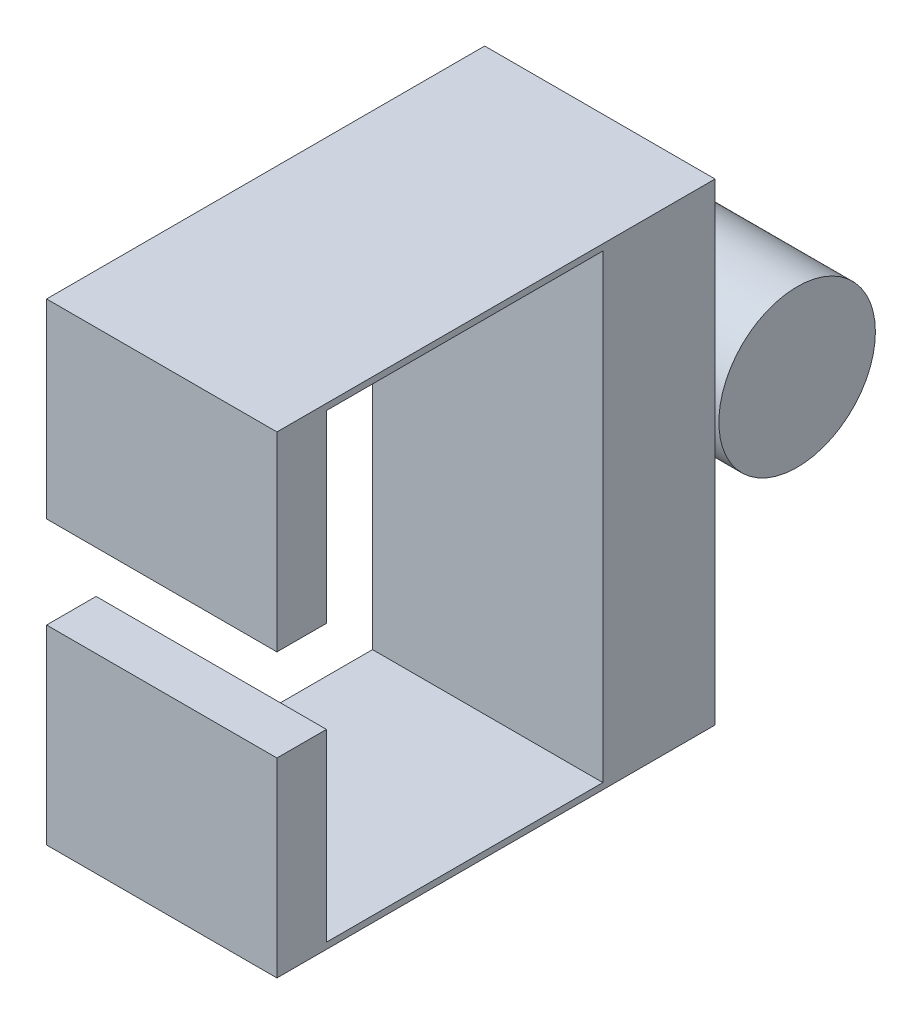
ISO-10303-21;
HEADER;
FILE_DESCRIPTION(('STEP AP214'),'2;1');
FILE_NAME('part.step','',(''),(''),'','','');
FILE_SCHEMA(('AUTOMOTIVE_DESIGN { 1 0 10303 214 1 1 1 1 }'));
ENDSEC;
DATA;
#1=APPLICATION_CONTEXT('core data for automotive mechanical design processes');
#2=APPLICATION_PROTOCOL_DEFINITION('international standard','automotive_design',2000,#1);
#3=PRODUCT_CONTEXT('',#1,'mechanical');
#4=PRODUCT('Part','Part','',(#3));
#5=PRODUCT_RELATED_PRODUCT_CATEGORY('part','',(#4));
#6=PRODUCT_DEFINITION_FORMATION('','',#4);
#7=PRODUCT_DEFINITION_CONTEXT('part definition',#1,'design');
#8=PRODUCT_DEFINITION('design','',#6,#7);
#9=PRODUCT_DEFINITION_SHAPE('','',#8);
#10=(LENGTH_UNIT() NAMED_UNIT(*) SI_UNIT(.MILLI.,.METRE.));
#11=(NAMED_UNIT(*) PLANE_ANGLE_UNIT() SI_UNIT($,.RADIAN.));
#12=(NAMED_UNIT(*) SI_UNIT($,.STERADIAN.) SOLID_ANGLE_UNIT());
#13=UNCERTAINTY_MEASURE_WITH_UNIT(LENGTH_MEASURE(1.E-05),#10,'distance_accuracy_value','');
#14=(GEOMETRIC_REPRESENTATION_CONTEXT(3) GLOBAL_UNCERTAINTY_ASSIGNED_CONTEXT((#13)) GLOBAL_UNIT_ASSIGNED_CONTEXT((#10,
#11,#12)) REPRESENTATION_CONTEXT('',''));
#15=CARTESIAN_POINT('',(0.,0.,0.));
#16=DIRECTION('',(0.,0.,1.));
#17=DIRECTION('',(1.,0.,0.));
#18=AXIS2_PLACEMENT_3D('',#15,#16,#17);
#19=CARTESIAN_POINT('',(-3.05675929736877,31.72968,74.9989691432887));
#20=DIRECTION('',(0.,1.,0.));
#21=DIRECTION('',(-1.,0.,0.));
#22=AXIS2_PLACEMENT_3D('',#19,#20,#21);
#23=PLANE('',#22);
#24=DIRECTION('',(1.,0.,0.));
#25=VECTOR('',#24,1.);
#26=CARTESIAN_POINT('',(-3.05675929736877,31.72968,68.1736477814844));
#27=LINE('',#26,#25);
#28=CARTESIAN_POINT('',(-3.05675929736877,31.72968,68.1736477814844));
#29=VERTEX_POINT('',#28);
#30=CARTESIAN_POINT('',(28.6932407026312,31.72968,68.1736477814844));
#31=VERTEX_POINT('',#30);
#32=EDGE_CURVE('E62',#29,#31,#27,.T.);
#33=ORIENTED_EDGE('',*,*,#32,.F.);
#34=DIRECTION('',(0.,0.,-1.));
#35=VECTOR('',#34,1.);
#36=CARTESIAN_POINT('',(-3.05675929736877,31.72968,74.9989691432887));
#37=LINE('',#36,#35);
#38=CARTESIAN_POINT('',(-3.05675929736877,31.72968,30.0736477814844));
#39=VERTEX_POINT('',#38);
#40=EDGE_CURVE('E11',#29,#39,#37,.T.);
#41=ORIENTED_EDGE('',*,*,#40,.T.);
#42=DIRECTION('',(1.,0.,0.));
#43=VECTOR('',#42,1.);
#44=CARTESIAN_POINT('',(-3.05675929736877,31.72968,30.0736477814844));
#45=LINE('',#44,#43);
#46=CARTESIAN_POINT('',(28.6932407026312,31.72968,30.0736477814844));
#47=VERTEX_POINT('',#46);
#48=EDGE_CURVE('E103',#39,#47,#45,.T.);
#49=ORIENTED_EDGE('',*,*,#48,.T.);
#50=DIRECTION('',(0.,0.,-1.));
#51=VECTOR('',#50,1.);
#52=CARTESIAN_POINT('',(28.6932407026312,31.72968,74.9989691432887));
#53=LINE('',#52,#51);
#54=EDGE_CURVE('E56',#31,#47,#53,.T.);
#55=ORIENTED_EDGE('',*,*,#54,.F.);
#56=EDGE_LOOP('',(#33,#41,#49,#55));
#57=FACE_BOUND('',#56,.T.);
#58=ADVANCED_FACE('F47',(#57),#23,.F.);
#59=CARTESIAN_POINT('',(-3.05675929736877,32.5937994297519,74.9989691432887));
#60=DIRECTION('',(1.,0.,0.));
#61=DIRECTION('',(0.,0.,-1.));
#62=AXIS2_PLACEMENT_3D('',#59,#60,#61);
#63=PLANE('',#62);
#64=DIRECTION('',(0.,0.,-1.));
#65=VECTOR('',#64,1.);
#66=CARTESIAN_POINT('',(-3.05675929736877,32.5937994297519,74.9989691432887));
#67=LINE('',#66,#65);
#68=CARTESIAN_POINT('',(-3.05675929736877,32.5937994297519,74.9989691432887));
#69=VERTEX_POINT('',#68);
#70=CARTESIAN_POINT('',(-3.05675929736877,32.5937994297519,14.6102924320035));
#71=VERTEX_POINT('',#70);
#72=EDGE_CURVE('E153',#69,#71,#67,.T.);
#73=ORIENTED_EDGE('',*,*,#72,.T.);
#74=DIRECTION('',(0.,-1.,0.));
#75=VECTOR('',#74,1.);
#76=CARTESIAN_POINT('',(-3.05675929736877,32.5937994297519,14.6102924320035));
#77=LINE('',#76,#75);
#78=CARTESIAN_POINT('',(-3.05675929736877,12.7,14.6102924320035));
#79=VERTEX_POINT('',#78);
#80=EDGE_CURVE('E190',#71,#79,#77,.T.);
#81=ORIENTED_EDGE('',*,*,#80,.T.);
#82=DIRECTION('',(0.,0.,-1.));
#83=VECTOR('',#82,1.);
#84=CARTESIAN_POINT('',(-3.05675929736877,12.7,-0.629707567996452));
#85=LINE('',#84,#83);
#86=CARTESIAN_POINT('',(-3.05675929736877,12.7,-0.629707567996452));
#87=VERTEX_POINT('',#86);
#88=EDGE_CURVE('E214',#79,#87,#85,.T.);
#89=ORIENTED_EDGE('',*,*,#88,.T.);
#90=CARTESIAN_POINT('',(-3.05675929736877,2.54,-0.62970756799652));
#91=DIRECTION('',(-1.,0.,0.));
#92=DIRECTION('',(0.,0.,-1.));
#93=AXIS2_PLACEMENT_3D('',#90,#91,#92);
#94=CIRCLE('',#93,10.16);
#95=CARTESIAN_POINT('',(-3.05675929736877,2.53999999999993,-10.7897075679965));
#96=VERTEX_POINT('',#95);
#97=EDGE_CURVE('E218',#87,#96,#94,.T.);
#98=ORIENTED_EDGE('',*,*,#97,.T.);
#99=DIRECTION('',(0.,-1.,0.));
#100=VECTOR('',#99,1.);
#101=CARTESIAN_POINT('',(-3.05675929736877,-2.53999999999993,-10.7897075679965));
#102=LINE('',#101,#100);
#103=CARTESIAN_POINT('',(-3.05675929736877,-2.53999999999993,-10.7897075679965));
#104=VERTEX_POINT('',#103);
#105=EDGE_CURVE('E222',#96,#104,#102,.T.);
#106=ORIENTED_EDGE('',*,*,#105,.T.);
#107=CARTESIAN_POINT('',(-3.05675929736877,-2.54,-0.629707567996522));
#108=DIRECTION('',(-1.,0.,0.));
#109=DIRECTION('',(0.,0.,-1.));
#110=AXIS2_PLACEMENT_3D('',#107,#108,#109);
#111=CIRCLE('',#110,10.16);
#112=CARTESIAN_POINT('',(-3.05675929736877,-12.7,-0.629707567996445));
#113=VERTEX_POINT('',#112);
#114=EDGE_CURVE('E205',#104,#113,#111,.T.);
#115=ORIENTED_EDGE('',*,*,#114,.T.);
#116=DIRECTION('',(0.,0.,1.));
#117=VECTOR('',#116,1.);
#118=CARTESIAN_POINT('',(-3.05675929736877,-12.7,-0.629707567996445));
#119=LINE('',#118,#117);
#120=CARTESIAN_POINT('',(-3.05675929736877,-12.7,14.6102924320035));
#121=VERTEX_POINT('',#120);
#122=EDGE_CURVE('E209',#113,#121,#119,.T.);
#123=ORIENTED_EDGE('',*,*,#122,.T.);
#124=CARTESIAN_POINT('',(-3.05675929736876,-32.5937994297519,14.6102924320035));
#125=VERTEX_POINT('',#124);
#126=EDGE_CURVE('E189',#121,#125,#77,.T.);
#127=ORIENTED_EDGE('',*,*,#126,.T.);
#128=DIRECTION('',(0.,0.,-1.));
#129=VECTOR('',#128,1.);
#130=CARTESIAN_POINT('',(-3.05675929736876,-32.5937994297519,30.0736477814844));
#131=LINE('',#130,#129);
#132=CARTESIAN_POINT('',(-3.05675929736877,-32.5937994297519,74.9989691432887));
#133=VERTEX_POINT('',#132);
#134=EDGE_CURVE('E200',#133,#125,#131,.T.);
#135=ORIENTED_EDGE('',*,*,#134,.F.);
#136=DIRECTION('',(0.,1.,0.));
#137=VECTOR('',#136,1.);
#138=CARTESIAN_POINT('',(-3.05675929736877,-32.5937994297519,74.9989691432887));
#139=LINE('',#138,#137);
#140=CARTESIAN_POINT('',(-3.05675929736877,-6.32968,74.9989691432887));
#141=VERTEX_POINT('',#140);
#142=EDGE_CURVE('E611',#133,#141,#139,.T.);
#143=ORIENTED_EDGE('',*,*,#142,.T.);
#144=DIRECTION('',(0.,0.,-1.));
#145=VECTOR('',#144,1.);
#146=CARTESIAN_POINT('',(-3.05675929736877,-6.32968,74.9989691432887));
#147=LINE('',#146,#145);
#148=CARTESIAN_POINT('',(-3.05675929736877,-6.32968,68.1736477814844));
#149=VERTEX_POINT('',#148);
#150=EDGE_CURVE('E594',#141,#149,#147,.T.);
#151=ORIENTED_EDGE('',*,*,#150,.T.);
#152=DIRECTION('',(0.,-1.,0.));
#153=VECTOR('',#152,1.);
#154=CARTESIAN_POINT('',(-3.05675929736877,-6.32968,68.1736477814844));
#155=LINE('',#154,#153);
#156=CARTESIAN_POINT('',(-3.05675929736877,-31.72968,68.1736477814844));
#157=VERTEX_POINT('',#156);
#158=EDGE_CURVE('E625',#149,#157,#155,.T.);
#159=ORIENTED_EDGE('',*,*,#158,.T.);
#160=DIRECTION('',(0.,0.,-1.));
#161=VECTOR('',#160,1.);
#162=CARTESIAN_POINT('',(-3.05675929736877,-31.72968,74.9989691432887));
#163=LINE('',#162,#161);
#164=CARTESIAN_POINT('',(-3.05675929736877,-31.72968,30.0736477814844));
#165=VERTEX_POINT('',#164);
#166=EDGE_CURVE('E170',#157,#165,#163,.T.);
#167=ORIENTED_EDGE('',*,*,#166,.T.);
#168=DIRECTION('',(0.,-1.,0.));
#169=VECTOR('',#168,1.);
#170=CARTESIAN_POINT('',(-3.05675929736877,32.5937994297519,30.0736477814844));
#171=LINE('',#170,#169);
#172=EDGE_CURVE('E166',#39,#165,#171,.T.);
#173=ORIENTED_EDGE('',*,*,#172,.F.);
#174=ORIENTED_EDGE('',*,*,#40,.F.);
#175=DIRECTION('',(0.,1.,0.));
#176=VECTOR('',#175,1.);
#177=CARTESIAN_POINT('',(-3.05675929736877,6.32968,68.1736477814844));
#178=LINE('',#177,#176);
#179=CARTESIAN_POINT('',(-3.05675929736877,6.32968,68.1736477814844));
#180=VERTEX_POINT('',#179);
#181=EDGE_CURVE('E130',#180,#29,#178,.T.);
#182=ORIENTED_EDGE('',*,*,#181,.F.);
#183=DIRECTION('',(0.,0.,-1.));
#184=VECTOR('',#183,1.);
#185=CARTESIAN_POINT('',(-3.05675929736877,6.32968,74.9989691432887));
#186=LINE('',#185,#184);
#187=CARTESIAN_POINT('',(-3.05675929736877,6.32968,74.9989691432887));
#188=VERTEX_POINT('',#187);
#189=EDGE_CURVE('E119',#188,#180,#186,.T.);
#190=ORIENTED_EDGE('',*,*,#189,.F.);
#191=DIRECTION('',(0.,-1.,0.));
#192=VECTOR('',#191,1.);
#193=CARTESIAN_POINT('',(-3.05675929736877,32.5937994297519,74.9989691432887));
#194=LINE('',#193,#192);
#195=EDGE_CURVE('E88',#69,#188,#194,.T.);
#196=ORIENTED_EDGE('',*,*,#195,.F.);
#197=EDGE_LOOP('',(#73,#81,#89,#98,#106,#115,#123,#127,#135,#143,#151,#159,#167,#173,#174,#182,
#190,#196));
#198=FACE_BOUND('',#197,.T.);
#199=ADVANCED_FACE('F49',(#198),#63,.F.);
#200=CARTESIAN_POINT('',(28.6932407026312,32.5937994297519,74.9989691432887));
#201=DIRECTION('',(-1.,0.,0.));
#202=DIRECTION('',(0.,0.,1.));
#203=AXIS2_PLACEMENT_3D('',#200,#201,#202);
#204=PLANE('',#203);
#205=ORIENTED_EDGE('',*,*,#54,.T.);
#206=DIRECTION('',(0.,1.,0.));
#207=VECTOR('',#206,1.);
#208=CARTESIAN_POINT('',(28.6932407026312,32.5937994297519,30.0736477814844));
#209=LINE('',#208,#207);
#210=CARTESIAN_POINT('',(28.6932407026312,-31.72968,30.0736477814844));
#211=VERTEX_POINT('',#210);
#212=EDGE_CURVE('E82',#211,#47,#209,.T.);
#213=ORIENTED_EDGE('',*,*,#212,.F.);
#214=DIRECTION('',(0.,0.,-1.));
#215=VECTOR('',#214,1.);
#216=CARTESIAN_POINT('',(28.6932407026312,-31.72968,74.9989691432887));
#217=LINE('',#216,#215);
#218=CARTESIAN_POINT('',(28.6932407026312,-31.72968,68.1736477814844));
#219=VERTEX_POINT('',#218);
#220=EDGE_CURVE('E631',#219,#211,#217,.T.);
#221=ORIENTED_EDGE('',*,*,#220,.F.);
#222=DIRECTION('',(0.,-1.,0.));
#223=VECTOR('',#222,1.);
#224=CARTESIAN_POINT('',(28.6932407026312,-6.32968,68.1736477814844));
#225=LINE('',#224,#223);
#226=CARTESIAN_POINT('',(28.6932407026312,-6.32968,68.1736477814844));
#227=VERTEX_POINT('',#226);
#228=EDGE_CURVE('E665',#227,#219,#225,.T.);
#229=ORIENTED_EDGE('',*,*,#228,.F.);
#230=DIRECTION('',(0.,0.,1.));
#231=VECTOR('',#230,1.);
#232=CARTESIAN_POINT('',(28.6932407026312,-6.32968,74.9989691432887));
#233=LINE('',#232,#231);
#234=CARTESIAN_POINT('',(28.6932407026312,-6.32968,74.9989691432887));
#235=VERTEX_POINT('',#234);
#236=EDGE_CURVE('E667',#227,#235,#233,.T.);
#237=ORIENTED_EDGE('',*,*,#236,.T.);
#238=DIRECTION('',(0.,-1.,0.));
#239=VECTOR('',#238,1.);
#240=CARTESIAN_POINT('',(28.6932407026312,-32.5937994297519,74.9989691432887));
#241=LINE('',#240,#239);
#242=CARTESIAN_POINT('',(28.6932407026312,-32.5937994297519,74.9989691432887));
#243=VERTEX_POINT('',#242);
#244=EDGE_CURVE('E617',#235,#243,#241,.T.);
#245=ORIENTED_EDGE('',*,*,#244,.T.);
#246=DIRECTION('',(0.,0.,-1.));
#247=VECTOR('',#246,1.);
#248=CARTESIAN_POINT('',(28.6932407026312,-32.5937994297519,30.0736477814844));
#249=LINE('',#248,#247);
#250=CARTESIAN_POINT('',(28.6932407026312,-32.5937994297519,14.6102924320035));
#251=VERTEX_POINT('',#250);
#252=EDGE_CURVE('E177',#243,#251,#249,.T.);
#253=ORIENTED_EDGE('',*,*,#252,.T.);
#254=DIRECTION('',(0.,1.,0.));
#255=VECTOR('',#254,1.);
#256=CARTESIAN_POINT('',(28.6932407026312,32.5937994297519,14.6102924320035));
#257=LINE('',#256,#255);
#258=CARTESIAN_POINT('',(28.6932407026312,32.5937994297519,14.6102924320035));
#259=VERTEX_POINT('',#258);
#260=EDGE_CURVE('E173',#251,#259,#257,.T.);
#261=ORIENTED_EDGE('',*,*,#260,.T.);
#262=DIRECTION('',(0.,0.,-1.));
#263=VECTOR('',#262,1.);
#264=CARTESIAN_POINT('',(28.6932407026312,32.5937994297519,74.9989691432887));
#265=LINE('',#264,#263);
#266=CARTESIAN_POINT('',(28.6932407026312,32.5937994297519,74.9989691432887));
#267=VERTEX_POINT('',#266);
#268=EDGE_CURVE('E159',#267,#259,#265,.T.);
#269=ORIENTED_EDGE('',*,*,#268,.F.);
#270=DIRECTION('',(0.,1.,0.));
#271=VECTOR('',#270,1.);
#272=CARTESIAN_POINT('',(28.6932407026312,32.5937994297519,74.9989691432887));
#273=LINE('',#272,#271);
#274=CARTESIAN_POINT('',(28.6932407026312,6.32968,74.9989691432887));
#275=VERTEX_POINT('',#274);
#276=EDGE_CURVE('E135',#275,#267,#273,.T.);
#277=ORIENTED_EDGE('',*,*,#276,.F.);
#278=DIRECTION('',(0.,0.,1.));
#279=VECTOR('',#278,1.);
#280=CARTESIAN_POINT('',(28.6932407026312,6.32968,74.9989691432887));
#281=LINE('',#280,#279);
#282=CARTESIAN_POINT('',(28.6932407026312,6.32968,68.1736477814844));
#283=VERTEX_POINT('',#282);
#284=EDGE_CURVE('E117',#283,#275,#281,.T.);
#285=ORIENTED_EDGE('',*,*,#284,.F.);
#286=DIRECTION('',(0.,1.,0.));
#287=VECTOR('',#286,1.);
#288=CARTESIAN_POINT('',(28.6932407026312,6.32968,68.1736477814844));
#289=LINE('',#288,#287);
#290=EDGE_CURVE('E126',#283,#31,#289,.T.);
#291=ORIENTED_EDGE('',*,*,#290,.T.);
#292=EDGE_LOOP('',(#205,#213,#221,#229,#237,#245,#253,#261,#269,#277,#285,#291));
#293=FACE_BOUND('',#292,.T.);
#294=ADVANCED_FACE('F133',(#293),#204,.F.);
#295=CARTESIAN_POINT('',(-3.05675929736877,32.5937994297519,74.9989691432887));
#296=DIRECTION('',(0.,-1.,0.));
#297=DIRECTION('',(1.,0.,0.));
#298=AXIS2_PLACEMENT_3D('',#295,#296,#297);
#299=PLANE('',#298);
#300=ORIENTED_EDGE('',*,*,#268,.T.);
#301=DIRECTION('',(-1.,0.,0.));
#302=VECTOR('',#301,1.);
#303=CARTESIAN_POINT('',(-3.05675929736877,32.5937994297519,14.6102924320035));
#304=LINE('',#303,#302);
#305=EDGE_CURVE('E185',#259,#71,#304,.T.);
#306=ORIENTED_EDGE('',*,*,#305,.T.);
#307=ORIENTED_EDGE('',*,*,#72,.F.);
#308=DIRECTION('',(-1.,0.,0.));
#309=VECTOR('',#308,1.);
#310=CARTESIAN_POINT('',(-3.05675929736877,32.5937994297519,74.9989691432887));
#311=LINE('',#310,#309);
#312=EDGE_CURVE('E71',#267,#69,#311,.T.);
#313=ORIENTED_EDGE('',*,*,#312,.F.);
#314=EDGE_LOOP('',(#300,#306,#307,#313));
#315=FACE_BOUND('',#314,.T.);
#316=ADVANCED_FACE('F355',(#315),#299,.F.);
#317=CARTESIAN_POINT('',(0.,0.,74.9989691432887));
#318=DIRECTION('',(0.,0.,1.));
#319=DIRECTION('',(1.,0.,0.));
#320=AXIS2_PLACEMENT_3D('',#317,#318,#319);
#321=PLANE('',#320);
#322=ORIENTED_EDGE('',*,*,#195,.T.);
#323=DIRECTION('',(-1.,0.,0.));
#324=VECTOR('',#323,1.);
#325=CARTESIAN_POINT('',(-3.05675929736877,6.32968,74.9989691432887));
#326=LINE('',#325,#324);
#327=EDGE_CURVE('E131',#275,#188,#326,.T.);
#328=ORIENTED_EDGE('',*,*,#327,.F.);
#329=ORIENTED_EDGE('',*,*,#276,.T.);
#330=ORIENTED_EDGE('',*,*,#312,.T.);
#331=EDGE_LOOP('',(#322,#328,#329,#330));
#332=FACE_BOUND('',#331,.T.);
#333=ADVANCED_FACE('F357',(#332),#321,.T.);
#334=CARTESIAN_POINT('',(-3.05675929736877,6.32968,68.1736477814844));
#335=DIRECTION('',(0.,0.,1.));
#336=DIRECTION('',(1.,0.,0.));
#337=AXIS2_PLACEMENT_3D('',#334,#335,#336);
#338=PLANE('',#337);
#339=ORIENTED_EDGE('',*,*,#32,.T.);
#340=ORIENTED_EDGE('',*,*,#290,.F.);
#341=DIRECTION('',(1.,0.,0.));
#342=VECTOR('',#341,1.);
#343=CARTESIAN_POINT('',(-3.05675929736877,6.32968,68.1736477814844));
#344=LINE('',#343,#342);
#345=EDGE_CURVE('E113',#180,#283,#344,.T.);
#346=ORIENTED_EDGE('',*,*,#345,.F.);
#347=ORIENTED_EDGE('',*,*,#181,.T.);
#348=EDGE_LOOP('',(#339,#340,#346,#347));
#349=FACE_BOUND('',#348,.T.);
#350=ADVANCED_FACE('F127',(#349),#338,.F.);
#351=CARTESIAN_POINT('',(0.,6.32968,0.));
#352=DIRECTION('',(0.,-1.,0.));
#353=DIRECTION('',(1.,0.,0.));
#354=AXIS2_PLACEMENT_3D('',#351,#352,#353);
#355=PLANE('',#354);
#356=ORIENTED_EDGE('',*,*,#189,.T.);
#357=ORIENTED_EDGE('',*,*,#345,.T.);
#358=ORIENTED_EDGE('',*,*,#284,.T.);
#359=ORIENTED_EDGE('',*,*,#327,.T.);
#360=EDGE_LOOP('',(#356,#357,#358,#359));
#361=FACE_BOUND('',#360,.T.);
#362=ADVANCED_FACE('F115',(#361),#355,.T.);
#363=CARTESIAN_POINT('',(25.4,0.,0.));
#364=DIRECTION('',(-1.,0.,0.));
#365=DIRECTION('',(0.,0.,1.));
#366=AXIS2_PLACEMENT_3D('',#363,#364,#365);
#367=CYLINDRICAL_SURFACE('',#366,10.7897075679965);
#368=CARTESIAN_POINT('',(25.4,0.,0.));
#369=DIRECTION('',(1.,0.,0.));
#370=DIRECTION('',(0.,0.,-1.));
#371=AXIS2_PLACEMENT_3D('',#368,#369,#370);
#372=CIRCLE('',#371,10.7897075679965);
#373=CARTESIAN_POINT('',(25.4,0.,-10.7897075679965));
#374=VERTEX_POINT('',#373);
#375=EDGE_CURVE('E143',#374,#374,#372,.T.);
#376=ORIENTED_EDGE('',*,*,#375,.F.);
#377=EDGE_LOOP('',(#376));
#378=FACE_BOUND('',#377,.T.);
#379=CARTESIAN_POINT('',(0.,0.,0.));
#380=DIRECTION('',(1.,0.,0.));
#381=DIRECTION('',(0.,0.,-1.));
#382=AXIS2_PLACEMENT_3D('',#379,#380,#381);
#383=CIRCLE('',#382,10.7897075679965);
#384=CARTESIAN_POINT('',(0.,0.,-10.7897075679965));
#385=VERTEX_POINT('',#384);
#386=EDGE_CURVE('E273',#385,#385,#383,.T.);
#387=ORIENTED_EDGE('',*,*,#386,.T.);
#388=EDGE_LOOP('',(#387));
#389=FACE_BOUND('',#388,.T.);
#390=ADVANCED_FACE('F336',(#378,#389),#367,.T.);
#391=CARTESIAN_POINT('',(25.4,0.,0.));
#392=DIRECTION('',(1.,0.,0.));
#393=DIRECTION('',(0.,0.,-1.));
#394=AXIS2_PLACEMENT_3D('',#391,#392,#393);
#395=PLANE('',#394);
#396=ORIENTED_EDGE('',*,*,#375,.T.);
#397=EDGE_LOOP('',(#396));
#398=FACE_BOUND('',#397,.T.);
#399=ADVANCED_FACE('F338',(#398),#395,.T.);
#400=CARTESIAN_POINT('',(0.,-2.54,-0.629707567996522));
#401=DIRECTION('',(1.,0.,0.));
#402=DIRECTION('',(0.,0.,-1.));
#403=AXIS2_PLACEMENT_3D('',#400,#401,#402);
#404=PLANE('',#403);
#405=DIRECTION('',(0.,-1.,0.));
#406=VECTOR('',#405,1.);
#407=CARTESIAN_POINT('',(0.,-2.53999999999993,-10.7897075679965));
#408=LINE('',#407,#406);
#409=CARTESIAN_POINT('',(0.,-2.53999999999993,-10.7897075679965));
#410=VERTEX_POINT('',#409);
#411=EDGE_CURVE('E246',#385,#410,#408,.T.);
#412=ORIENTED_EDGE('',*,*,#411,.F.);
#413=ORIENTED_EDGE('',*,*,#386,.F.);
#414=CARTESIAN_POINT('',(0.,2.53999999999993,-10.7897075679965));
#415=VERTEX_POINT('',#414);
#416=EDGE_CURVE('E210',#415,#385,#408,.T.);
#417=ORIENTED_EDGE('',*,*,#416,.F.);
#418=CARTESIAN_POINT('',(0.,2.54,-0.62970756799652));
#419=DIRECTION('',(-1.,0.,0.));
#420=DIRECTION('',(0.,0.,-1.));
#421=AXIS2_PLACEMENT_3D('',#418,#419,#420);
#422=CIRCLE('',#421,10.16);
#423=CARTESIAN_POINT('',(0.,12.7,-0.629707567996452));
#424=VERTEX_POINT('',#423);
#425=EDGE_CURVE('E242',#424,#415,#422,.T.);
#426=ORIENTED_EDGE('',*,*,#425,.F.);
#427=DIRECTION('',(0.,0.,-1.));
#428=VECTOR('',#427,1.);
#429=CARTESIAN_POINT('',(0.,12.7,-0.629707567996452));
#430=LINE('',#429,#428);
#431=CARTESIAN_POINT('',(0.,12.7,14.6102924320035));
#432=VERTEX_POINT('',#431);
#433=EDGE_CURVE('E238',#432,#424,#430,.T.);
#434=ORIENTED_EDGE('',*,*,#433,.F.);
#435=DIRECTION('',(0.,1.,0.));
#436=VECTOR('',#435,1.);
#437=CARTESIAN_POINT('',(0.,-12.7,14.6102924320035));
#438=LINE('',#437,#436);
#439=CARTESIAN_POINT('',(0.,-12.7,14.6102924320035));
#440=VERTEX_POINT('',#439);
#441=EDGE_CURVE('E234',#440,#432,#438,.T.);
#442=ORIENTED_EDGE('',*,*,#441,.F.);
#443=DIRECTION('',(0.,0.,1.));
#444=VECTOR('',#443,1.);
#445=CARTESIAN_POINT('',(0.,-12.7,-0.629707567996445));
#446=LINE('',#445,#444);
#447=CARTESIAN_POINT('',(0.,-12.7,-0.629707567996445));
#448=VERTEX_POINT('',#447);
#449=EDGE_CURVE('E230',#448,#440,#446,.T.);
#450=ORIENTED_EDGE('',*,*,#449,.F.);
#451=CARTESIAN_POINT('',(0.,-2.54,-0.629707567996522));
#452=DIRECTION('',(-1.,0.,0.));
#453=DIRECTION('',(0.,0.,-1.));
#454=AXIS2_PLACEMENT_3D('',#451,#452,#453);
#455=CIRCLE('',#454,10.16);
#456=EDGE_CURVE('E204',#410,#448,#455,.T.);
#457=ORIENTED_EDGE('',*,*,#456,.F.);
#458=EDGE_LOOP('',(#412,#413,#417,#426,#434,#442,#450,#457));
#459=FACE_BOUND('',#458,.T.);
#460=ADVANCED_FACE('F302',(#459),#404,.T.);
#461=CARTESIAN_POINT('',(-3.05675929736877,-2.54,-0.629707567996522));
#462=DIRECTION('',(1.,0.,0.));
#463=DIRECTION('',(0.,0.,-1.));
#464=AXIS2_PLACEMENT_3D('',#461,#462,#463);
#465=CYLINDRICAL_SURFACE('',#464,10.16);
#466=ORIENTED_EDGE('',*,*,#456,.T.);
#467=DIRECTION('',(1.,0.,0.));
#468=VECTOR('',#467,1.);
#469=CARTESIAN_POINT('',(-3.05675929736877,-12.7,-0.629707567996445));
#470=LINE('',#469,#468);
#471=EDGE_CURVE('E269',#113,#448,#470,.T.);
#472=ORIENTED_EDGE('',*,*,#471,.F.);
#473=ORIENTED_EDGE('',*,*,#114,.F.);
#474=DIRECTION('',(1.,0.,0.));
#475=VECTOR('',#474,1.);
#476=CARTESIAN_POINT('',(-3.05675929736877,-2.53999999999993,-10.7897075679965));
#477=LINE('',#476,#475);
#478=EDGE_CURVE('E226',#104,#410,#477,.T.);
#479=ORIENTED_EDGE('',*,*,#478,.T.);
#480=EDGE_LOOP('',(#466,#472,#473,#479));
#481=FACE_BOUND('',#480,.T.);
#482=ADVANCED_FACE('F298',(#481),#465,.T.);
#483=CARTESIAN_POINT('',(-3.05675929736877,-12.7,-0.629707567996445));
#484=DIRECTION('',(0.,1.,0.));
#485=DIRECTION('',(0.,0.,1.));
#486=AXIS2_PLACEMENT_3D('',#483,#484,#485);
#487=PLANE('',#486);
#488=ORIENTED_EDGE('',*,*,#449,.T.);
#489=DIRECTION('',(1.,0.,0.));
#490=VECTOR('',#489,1.);
#491=CARTESIAN_POINT('',(-3.05675929736877,-12.7,14.6102924320035));
#492=LINE('',#491,#490);
#493=EDGE_CURVE('E265',#121,#440,#492,.T.);
#494=ORIENTED_EDGE('',*,*,#493,.F.);
#495=ORIENTED_EDGE('',*,*,#122,.F.);
#496=ORIENTED_EDGE('',*,*,#471,.T.);
#497=EDGE_LOOP('',(#488,#494,#495,#496));
#498=FACE_BOUND('',#497,.T.);
#499=ADVANCED_FACE('F311',(#498),#487,.F.);
#500=CARTESIAN_POINT('',(-3.05675929736877,12.7,-0.629707567996452));
#501=DIRECTION('',(0.,-1.,0.));
#502=DIRECTION('',(0.,0.,-1.));
#503=AXIS2_PLACEMENT_3D('',#500,#501,#502);
#504=PLANE('',#503);
#505=ORIENTED_EDGE('',*,*,#433,.T.);
#506=DIRECTION('',(1.,0.,0.));
#507=VECTOR('',#506,1.);
#508=CARTESIAN_POINT('',(-3.05675929736877,12.7,-0.629707567996452));
#509=LINE('',#508,#507);
#510=EDGE_CURVE('E257',#87,#424,#509,.T.);
#511=ORIENTED_EDGE('',*,*,#510,.F.);
#512=ORIENTED_EDGE('',*,*,#88,.F.);
#513=DIRECTION('',(1.,0.,0.));
#514=VECTOR('',#513,1.);
#515=CARTESIAN_POINT('',(-3.05675929736877,12.7,14.6102924320035));
#516=LINE('',#515,#514);
#517=EDGE_CURVE('E261',#79,#432,#516,.T.);
#518=ORIENTED_EDGE('',*,*,#517,.T.);
#519=EDGE_LOOP('',(#505,#511,#512,#518));
#520=FACE_BOUND('',#519,.T.);
#521=ADVANCED_FACE('F415',(#520),#504,.F.);
#522=CARTESIAN_POINT('',(-3.05675929736877,2.54,-0.62970756799652));
#523=DIRECTION('',(1.,0.,0.));
#524=DIRECTION('',(0.,0.,-1.));
#525=AXIS2_PLACEMENT_3D('',#522,#523,#524);
#526=CYLINDRICAL_SURFACE('',#525,10.16);
#527=ORIENTED_EDGE('',*,*,#425,.T.);
#528=DIRECTION('',(1.,0.,0.));
#529=VECTOR('',#528,1.);
#530=CARTESIAN_POINT('',(-3.05675929736877,2.53999999999993,-10.7897075679965));
#531=LINE('',#530,#529);
#532=EDGE_CURVE('E253',#96,#415,#531,.T.);
#533=ORIENTED_EDGE('',*,*,#532,.F.);
#534=ORIENTED_EDGE('',*,*,#97,.F.);
#535=ORIENTED_EDGE('',*,*,#510,.T.);
#536=EDGE_LOOP('',(#527,#533,#534,#535));
#537=FACE_BOUND('',#536,.T.);
#538=ADVANCED_FACE('F332',(#537),#526,.T.);
#539=CARTESIAN_POINT('',(-3.05675929736877,-2.53999999999993,-10.7897075679965));
#540=DIRECTION('',(0.,0.,1.));
#541=DIRECTION('',(1.,0.,0.));
#542=AXIS2_PLACEMENT_3D('',#539,#540,#541);
#543=PLANE('',#542);
#544=ORIENTED_EDGE('',*,*,#416,.T.);
#545=ORIENTED_EDGE('',*,*,#411,.T.);
#546=ORIENTED_EDGE('',*,*,#478,.F.);
#547=ORIENTED_EDGE('',*,*,#105,.F.);
#548=ORIENTED_EDGE('',*,*,#532,.T.);
#549=EDGE_LOOP('',(#544,#545,#546,#547,#548));
#550=FACE_BOUND('',#549,.T.);
#551=ADVANCED_FACE('F286',(#550),#543,.F.);
#552=CARTESIAN_POINT('',(0.,0.,14.6102924320035));
#553=DIRECTION('',(0.,0.,-1.));
#554=DIRECTION('',(-1.,0.,0.));
#555=AXIS2_PLACEMENT_3D('',#552,#553,#554);
#556=PLANE('',#555);
#557=ORIENTED_EDGE('',*,*,#517,.F.);
#558=ORIENTED_EDGE('',*,*,#80,.F.);
#559=ORIENTED_EDGE('',*,*,#305,.F.);
#560=ORIENTED_EDGE('',*,*,#260,.F.);
#561=DIRECTION('',(1.,0.,0.));
#562=VECTOR('',#561,1.);
#563=CARTESIAN_POINT('',(-3.05675929736876,-32.5937994297519,14.6102924320035));
#564=LINE('',#563,#562);
#565=EDGE_CURVE('E180',#125,#251,#564,.T.);
#566=ORIENTED_EDGE('',*,*,#565,.F.);
#567=ORIENTED_EDGE('',*,*,#126,.F.);
#568=ORIENTED_EDGE('',*,*,#493,.T.);
#569=ORIENTED_EDGE('',*,*,#441,.T.);
#570=EDGE_LOOP('',(#557,#558,#559,#560,#566,#567,#568,#569));
#571=FACE_BOUND('',#570,.T.);
#572=ADVANCED_FACE('F444',(#571),#556,.T.);
#573=CARTESIAN_POINT('',(-3.05675929736876,-32.5937994297519,30.0736477814844));
#574=DIRECTION('',(0.,1.,0.));
#575=DIRECTION('',(-1.,0.,0.));
#576=AXIS2_PLACEMENT_3D('',#573,#574,#575);
#577=PLANE('',#576);
#578=ORIENTED_EDGE('',*,*,#565,.T.);
#579=ORIENTED_EDGE('',*,*,#252,.F.);
#580=DIRECTION('',(-1.,0.,0.));
#581=VECTOR('',#580,1.);
#582=CARTESIAN_POINT('',(-3.05675929736877,-32.5937994297519,74.9989691432887));
#583=LINE('',#582,#581);
#584=EDGE_CURVE('E623',#243,#133,#583,.T.);
#585=ORIENTED_EDGE('',*,*,#584,.T.);
#586=ORIENTED_EDGE('',*,*,#134,.T.);
#587=EDGE_LOOP('',(#578,#579,#585,#586));
#588=FACE_BOUND('',#587,.T.);
#589=ADVANCED_FACE('F454',(#588),#577,.F.);
#590=CARTESIAN_POINT('',(0.,0.,30.0736477814844));
#591=DIRECTION('',(0.,0.,-1.));
#592=DIRECTION('',(-1.,0.,0.));
#593=AXIS2_PLACEMENT_3D('',#590,#591,#592);
#594=PLANE('',#593);
#595=ORIENTED_EDGE('',*,*,#48,.F.);
#596=ORIENTED_EDGE('',*,*,#172,.T.);
#597=DIRECTION('',(1.,0.,0.));
#598=VECTOR('',#597,1.);
#599=CARTESIAN_POINT('',(-3.05675929736877,-31.72968,30.0736477814844));
#600=LINE('',#599,#598);
#601=EDGE_CURVE('E618',#165,#211,#600,.T.);
#602=ORIENTED_EDGE('',*,*,#601,.T.);
#603=ORIENTED_EDGE('',*,*,#212,.T.);
#604=EDGE_LOOP('',(#595,#596,#602,#603));
#605=FACE_BOUND('',#604,.T.);
#606=ADVANCED_FACE('F466',(#605),#594,.F.);
#607=CARTESIAN_POINT('',(-3.05675929736877,-31.72968,74.9989691432887));
#608=DIRECTION('',(0.,-1.,0.));
#609=DIRECTION('',(-1.,0.,0.));
#610=AXIS2_PLACEMENT_3D('',#607,#608,#609);
#611=PLANE('',#610);
#612=DIRECTION('',(1.,0.,0.));
#613=VECTOR('',#612,1.);
#614=CARTESIAN_POINT('',(-3.05675929736877,-31.72968,68.1736477814844));
#615=LINE('',#614,#613);
#616=EDGE_CURVE('E607',#157,#219,#615,.T.);
#617=ORIENTED_EDGE('',*,*,#616,.T.);
#618=ORIENTED_EDGE('',*,*,#220,.T.);
#619=ORIENTED_EDGE('',*,*,#601,.F.);
#620=ORIENTED_EDGE('',*,*,#166,.F.);
#621=EDGE_LOOP('',(#617,#618,#619,#620));
#622=FACE_BOUND('',#621,.T.);
#623=ADVANCED_FACE('F478',(#622),#611,.F.);
#624=CARTESIAN_POINT('',(0.,0.,74.9989691432887));
#625=DIRECTION('',(0.,0.,1.));
#626=DIRECTION('',(1.,0.,0.));
#627=AXIS2_PLACEMENT_3D('',#624,#625,#626);
#628=PLANE('',#627);
#629=ORIENTED_EDGE('',*,*,#142,.F.);
#630=ORIENTED_EDGE('',*,*,#584,.F.);
#631=ORIENTED_EDGE('',*,*,#244,.F.);
#632=DIRECTION('',(-1.,0.,0.));
#633=VECTOR('',#632,1.);
#634=CARTESIAN_POINT('',(-3.05675929736877,-6.32968,74.9989691432887));
#635=LINE('',#634,#633);
#636=EDGE_CURVE('E599',#235,#141,#635,.T.);
#637=ORIENTED_EDGE('',*,*,#636,.T.);
#638=EDGE_LOOP('',(#629,#630,#631,#637));
#639=FACE_BOUND('',#638,.T.);
#640=ADVANCED_FACE('F488',(#639),#628,.T.);
#641=CARTESIAN_POINT('',(-3.05675929736877,-6.32968,68.1736477814844));
#642=DIRECTION('',(0.,0.,1.));
#643=DIRECTION('',(1.,0.,0.));
#644=AXIS2_PLACEMENT_3D('',#641,#642,#643);
#645=PLANE('',#644);
#646=ORIENTED_EDGE('',*,*,#616,.F.);
#647=ORIENTED_EDGE('',*,*,#158,.F.);
#648=DIRECTION('',(1.,0.,0.));
#649=VECTOR('',#648,1.);
#650=CARTESIAN_POINT('',(-3.05675929736877,-6.32968,68.1736477814844));
#651=LINE('',#650,#649);
#652=EDGE_CURVE('E603',#149,#227,#651,.T.);
#653=ORIENTED_EDGE('',*,*,#652,.T.);
#654=ORIENTED_EDGE('',*,*,#228,.T.);
#655=EDGE_LOOP('',(#646,#647,#653,#654));
#656=FACE_BOUND('',#655,.T.);
#657=ADVANCED_FACE('F499',(#656),#645,.F.);
#658=CARTESIAN_POINT('',(0.,-6.32968,0.));
#659=DIRECTION('',(0.,1.,0.));
#660=DIRECTION('',(1.,0.,0.));
#661=AXIS2_PLACEMENT_3D('',#658,#659,#660);
#662=PLANE('',#661);
#663=ORIENTED_EDGE('',*,*,#150,.F.);
#664=ORIENTED_EDGE('',*,*,#636,.F.);
#665=ORIENTED_EDGE('',*,*,#236,.F.);
#666=ORIENTED_EDGE('',*,*,#652,.F.);
#667=EDGE_LOOP('',(#663,#664,#665,#666));
#668=FACE_BOUND('',#667,.T.);
#669=ADVANCED_FACE('F511',(#668),#662,.T.);
#670=CLOSED_SHELL('',(#58,#199,#294,#316,#333,#350,#362,#390,#399,#460,#482,#499,#521,#538,#551,
#572,#589,#606,#623,#640,#657,#669));
#671=MANIFOLD_SOLID_BREP('B2',#670);
#672=ADVANCED_BREP_SHAPE_REPRESENTATION('',(#18,#671),#14);
#673=SHAPE_DEFINITION_REPRESENTATION(#9,#672);
ENDSEC;
END-ISO-10303-21;
